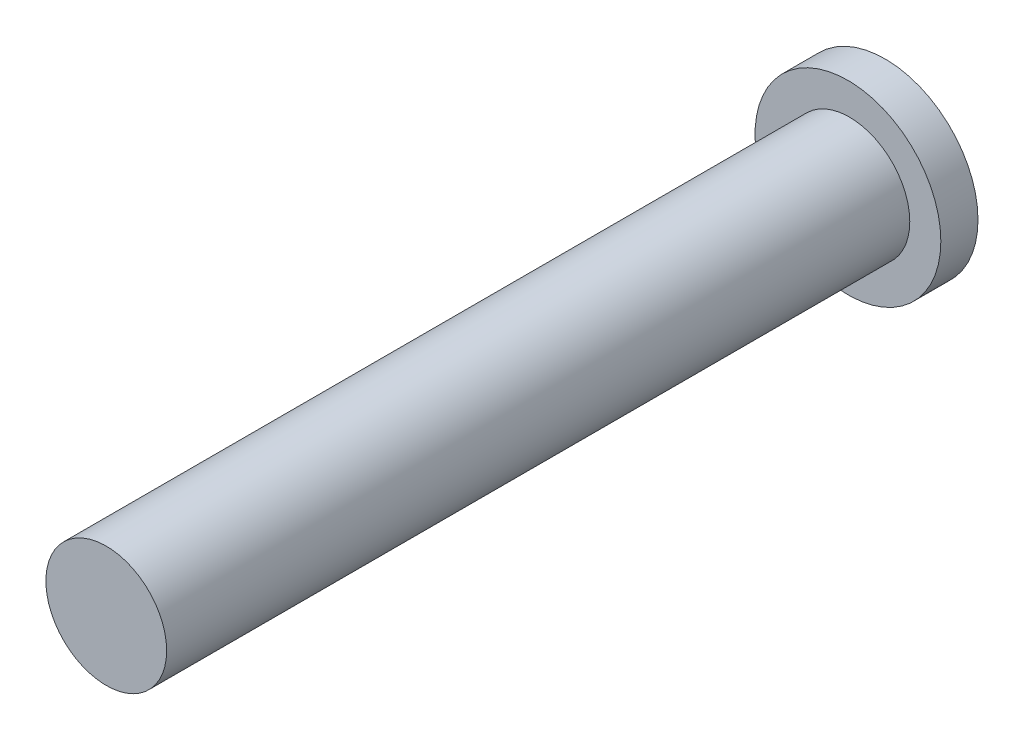
ISO-10303-21;
HEADER;
FILE_DESCRIPTION(('STEP AP214'),'2;1');
FILE_NAME('part.step','',(''),(''),'','','');
FILE_SCHEMA(('AUTOMOTIVE_DESIGN { 1 0 10303 214 1 1 1 1 }'));
ENDSEC;
DATA;
#1=APPLICATION_CONTEXT('core data for automotive mechanical design processes');
#2=APPLICATION_PROTOCOL_DEFINITION('international standard','automotive_design',2000,#1);
#3=PRODUCT_CONTEXT('',#1,'mechanical');
#4=PRODUCT('Part','Part','',(#3));
#5=PRODUCT_RELATED_PRODUCT_CATEGORY('part','',(#4));
#6=PRODUCT_DEFINITION_FORMATION('','',#4);
#7=PRODUCT_DEFINITION_CONTEXT('part definition',#1,'design');
#8=PRODUCT_DEFINITION('design','',#6,#7);
#9=PRODUCT_DEFINITION_SHAPE('','',#8);
#10=(LENGTH_UNIT() NAMED_UNIT(*) SI_UNIT(.MILLI.,.METRE.));
#11=(NAMED_UNIT(*) PLANE_ANGLE_UNIT() SI_UNIT($,.RADIAN.));
#12=(NAMED_UNIT(*) SI_UNIT($,.STERADIAN.) SOLID_ANGLE_UNIT());
#13=UNCERTAINTY_MEASURE_WITH_UNIT(LENGTH_MEASURE(1.E-05),#10,'distance_accuracy_value','');
#14=(GEOMETRIC_REPRESENTATION_CONTEXT(3) GLOBAL_UNCERTAINTY_ASSIGNED_CONTEXT((#13)) GLOBAL_UNIT_ASSIGNED_CONTEXT((#10,
#11,#12)) REPRESENTATION_CONTEXT('',''));
#15=CARTESIAN_POINT('',(0.,0.,0.));
#16=DIRECTION('',(0.,0.,1.));
#17=DIRECTION('',(1.,0.,0.));
#18=AXIS2_PLACEMENT_3D('',#15,#16,#17);
#19=CARTESIAN_POINT('',(-2.46568742496555,0.403476124085272,2.));
#20=DIRECTION('',(0.,0.,-1.));
#21=DIRECTION('',(-1.,0.,0.));
#22=AXIS2_PLACEMENT_3D('',#19,#20,#21);
#23=CYLINDRICAL_SURFACE('',#22,5.);
#24=CARTESIAN_POINT('',(-2.46568742496555,0.403476124085272,2.));
#25=DIRECTION('',(0.,0.,1.));
#26=DIRECTION('',(1.,0.,0.));
#27=AXIS2_PLACEMENT_3D('',#24,#25,#26);
#28=CIRCLE('',#27,5.);
#29=CARTESIAN_POINT('',(2.53431257503444,0.403476124085272,2.));
#30=VERTEX_POINT('',#29);
#31=EDGE_CURVE('E10',#30,#30,#28,.T.);
#32=ORIENTED_EDGE('',*,*,#31,.F.);
#33=EDGE_LOOP('',(#32));
#34=FACE_BOUND('',#33,.T.);
#35=CARTESIAN_POINT('',(-2.46568742496555,0.403476124085272,0.));
#36=DIRECTION('',(0.,0.,1.));
#37=DIRECTION('',(1.,0.,0.));
#38=AXIS2_PLACEMENT_3D('',#35,#36,#37);
#39=CIRCLE('',#38,5.);
#40=CARTESIAN_POINT('',(2.53431257503444,0.403476124085272,0.));
#41=VERTEX_POINT('',#40);
#42=EDGE_CURVE('E39',#41,#41,#39,.T.);
#43=ORIENTED_EDGE('',*,*,#42,.T.);
#44=EDGE_LOOP('',(#43));
#45=FACE_BOUND('',#44,.T.);
#46=ADVANCED_FACE('F36',(#34,#45),#23,.T.);
#47=CARTESIAN_POINT('',(-2.46568742496555,0.403476124085272,2.));
#48=DIRECTION('',(0.,0.,1.));
#49=DIRECTION('',(1.,0.,0.));
#50=AXIS2_PLACEMENT_3D('',#47,#48,#49);
#51=PLANE('',#50);
#52=CARTESIAN_POINT('',(-2.38755518513607,0.481608363914769,2.));
#53=DIRECTION('',(0.,0.,1.));
#54=DIRECTION('',(1.,0.,0.));
#55=AXIS2_PLACEMENT_3D('',#52,#53,#54);
#56=CIRCLE('',#55,3.25);
#57=CARTESIAN_POINT('',(0.862444814863935,0.481608363914769,2.));
#58=VERTEX_POINT('',#57);
#59=EDGE_CURVE('E48',#58,#58,#56,.T.);
#60=ORIENTED_EDGE('',*,*,#59,.F.);
#61=EDGE_LOOP('',(#60));
#62=FACE_BOUND('',#61,.T.);
#63=ORIENTED_EDGE('',*,*,#31,.T.);
#64=EDGE_LOOP('',(#63));
#65=FACE_BOUND('',#64,.T.);
#66=ADVANCED_FACE('F63',(#62,#65),#51,.T.);
#67=CARTESIAN_POINT('',(-2.46568742496555,0.403476124085272,0.));
#68=DIRECTION('',(0.,0.,1.));
#69=DIRECTION('',(1.,0.,0.));
#70=AXIS2_PLACEMENT_3D('',#67,#68,#69);
#71=PLANE('',#70);
#72=ORIENTED_EDGE('',*,*,#42,.F.);
#73=EDGE_LOOP('',(#72));
#74=FACE_BOUND('',#73,.T.);
#75=ADVANCED_FACE('F59',(#74),#71,.F.);
#76=CARTESIAN_POINT('',(-2.38755518513607,0.481608363914769,42.));
#77=DIRECTION('',(0.,0.,-1.));
#78=DIRECTION('',(-1.,0.,0.));
#79=AXIS2_PLACEMENT_3D('',#76,#77,#78);
#80=CYLINDRICAL_SURFACE('',#79,3.25);
#81=CARTESIAN_POINT('',(-2.38755518513607,0.481608363914769,42.));
#82=DIRECTION('',(0.,0.,1.));
#83=DIRECTION('',(1.,0.,0.));
#84=AXIS2_PLACEMENT_3D('',#81,#82,#83);
#85=CIRCLE('',#84,3.25);
#86=CARTESIAN_POINT('',(0.862444814863935,0.481608363914769,42.));
#87=VERTEX_POINT('',#86);
#88=EDGE_CURVE('E46',#87,#87,#85,.T.);
#89=ORIENTED_EDGE('',*,*,#88,.F.);
#90=EDGE_LOOP('',(#89));
#91=FACE_BOUND('',#90,.T.);
#92=ORIENTED_EDGE('',*,*,#59,.T.);
#93=EDGE_LOOP('',(#92));
#94=FACE_BOUND('',#93,.T.);
#95=ADVANCED_FACE('F56',(#91,#94),#80,.T.);
#96=CARTESIAN_POINT('',(-2.38755518513607,0.481608363914769,42.));
#97=DIRECTION('',(0.,0.,1.));
#98=DIRECTION('',(1.,0.,0.));
#99=AXIS2_PLACEMENT_3D('',#96,#97,#98);
#100=PLANE('',#99);
#101=ORIENTED_EDGE('',*,*,#88,.T.);
#102=EDGE_LOOP('',(#101));
#103=FACE_BOUND('',#102,.T.);
#104=ADVANCED_FACE('F54',(#103),#100,.T.);
#105=CLOSED_SHELL('',(#46,#66,#75,#95,#104));
#106=MANIFOLD_SOLID_BREP('B2',#105);
#107=ADVANCED_BREP_SHAPE_REPRESENTATION('',(#18,#106),#14);
#108=SHAPE_DEFINITION_REPRESENTATION(#9,#107);
ENDSEC;
END-ISO-10303-21;
